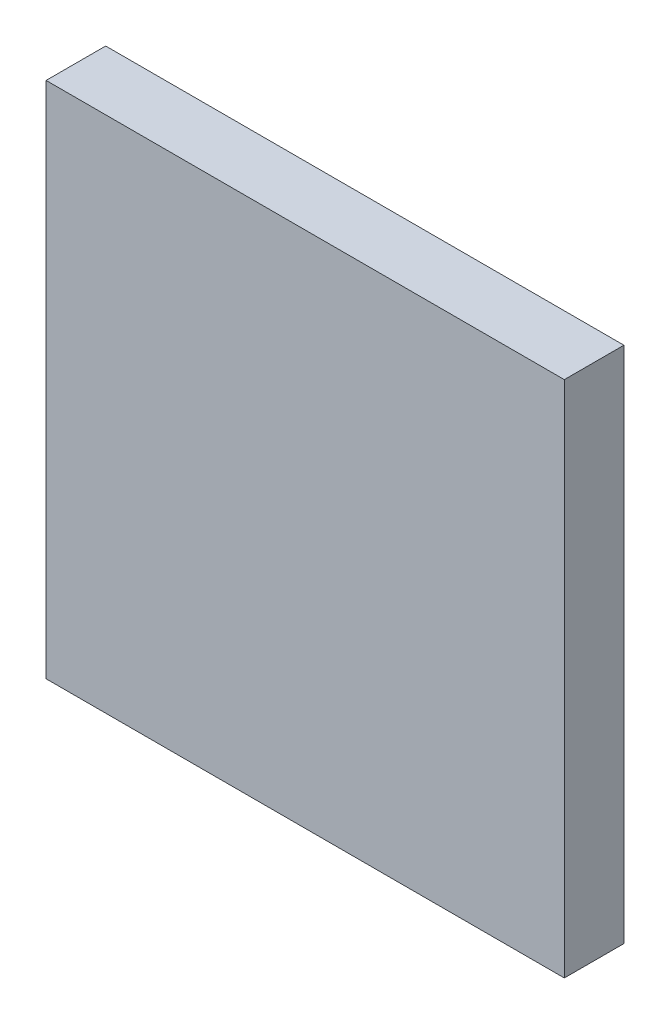
ISO-10303-21;
HEADER;
FILE_DESCRIPTION(('STEP AP214'),'2;1');
FILE_NAME('part.step','',(''),(''),'','','');
FILE_SCHEMA(('AUTOMOTIVE_DESIGN { 1 0 10303 214 1 1 1 1 }'));
ENDSEC;
DATA;
#1=APPLICATION_CONTEXT('core data for automotive mechanical design processes');
#2=APPLICATION_PROTOCOL_DEFINITION('international standard','automotive_design',2000,#1);
#3=PRODUCT_CONTEXT('',#1,'mechanical');
#4=PRODUCT('Part','Part','',(#3));
#5=PRODUCT_RELATED_PRODUCT_CATEGORY('part','',(#4));
#6=PRODUCT_DEFINITION_FORMATION('','',#4);
#7=PRODUCT_DEFINITION_CONTEXT('part definition',#1,'design');
#8=PRODUCT_DEFINITION('design','',#6,#7);
#9=PRODUCT_DEFINITION_SHAPE('','',#8);
#10=(LENGTH_UNIT() NAMED_UNIT(*) SI_UNIT(.MILLI.,.METRE.));
#11=(NAMED_UNIT(*) PLANE_ANGLE_UNIT() SI_UNIT($,.RADIAN.));
#12=(NAMED_UNIT(*) SI_UNIT($,.STERADIAN.) SOLID_ANGLE_UNIT());
#13=UNCERTAINTY_MEASURE_WITH_UNIT(LENGTH_MEASURE(1.E-05),#10,'distance_accuracy_value','');
#14=(GEOMETRIC_REPRESENTATION_CONTEXT(3) GLOBAL_UNCERTAINTY_ASSIGNED_CONTEXT((#13)) GLOBAL_UNIT_ASSIGNED_CONTEXT((#10,
#11,#12)) REPRESENTATION_CONTEXT('',''));
#15=CARTESIAN_POINT('',(0.,0.,0.));
#16=DIRECTION('',(0.,0.,1.));
#17=DIRECTION('',(1.,0.,0.));
#18=AXIS2_PLACEMENT_3D('',#15,#16,#17);
#19=CARTESIAN_POINT('',(0.,0.,-2.921));
#20=DIRECTION('',(-1.,0.,0.));
#21=DIRECTION('',(0.,0.,1.));
#22=AXIS2_PLACEMENT_3D('',#19,#20,#21);
#23=PLANE('',#22);
#24=DIRECTION('',(0.,-1.,0.));
#25=VECTOR('',#24,1.);
#26=CARTESIAN_POINT('',(0.,0.,0.));
#27=LINE('',#26,#25);
#28=CARTESIAN_POINT('',(0.,25.4,0.));
#29=VERTEX_POINT('',#28);
#30=CARTESIAN_POINT('',(0.,0.,0.));
#31=VERTEX_POINT('',#30);
#32=EDGE_CURVE('E100',#29,#31,#27,.T.);
#33=ORIENTED_EDGE('',*,*,#32,.F.);
#34=DIRECTION('',(0.,0.,1.));
#35=VECTOR('',#34,1.);
#36=CARTESIAN_POINT('',(0.,25.4,-2.921));
#37=LINE('',#36,#35);
#38=CARTESIAN_POINT('',(0.,25.4,-2.921));
#39=VERTEX_POINT('',#38);
#40=EDGE_CURVE('E11',#39,#29,#37,.T.);
#41=ORIENTED_EDGE('',*,*,#40,.F.);
#42=DIRECTION('',(0.,-1.,0.));
#43=VECTOR('',#42,1.);
#44=CARTESIAN_POINT('',(0.,0.,-2.921));
#45=LINE('',#44,#43);
#46=CARTESIAN_POINT('',(0.,0.,-2.921));
#47=VERTEX_POINT('',#46);
#48=EDGE_CURVE('E94',#39,#47,#45,.T.);
#49=ORIENTED_EDGE('',*,*,#48,.T.);
#50=DIRECTION('',(0.,0.,1.));
#51=VECTOR('',#50,1.);
#52=CARTESIAN_POINT('',(0.,0.,-2.921));
#53=LINE('',#52,#51);
#54=EDGE_CURVE('E39',#47,#31,#53,.T.);
#55=ORIENTED_EDGE('',*,*,#54,.T.);
#56=EDGE_LOOP('',(#33,#41,#49,#55));
#57=FACE_BOUND('',#56,.T.);
#58=ADVANCED_FACE('F36',(#57),#23,.T.);
#59=CARTESIAN_POINT('',(0.,25.4,-2.921));
#60=DIRECTION('',(0.,1.,0.));
#61=DIRECTION('',(0.,0.,1.));
#62=AXIS2_PLACEMENT_3D('',#59,#60,#61);
#63=PLANE('',#62);
#64=DIRECTION('',(-1.,0.,0.));
#65=VECTOR('',#64,1.);
#66=CARTESIAN_POINT('',(0.,25.4,0.));
#67=LINE('',#66,#65);
#68=CARTESIAN_POINT('',(25.4,25.4,0.));
#69=VERTEX_POINT('',#68);
#70=EDGE_CURVE('E96',#69,#29,#67,.T.);
#71=ORIENTED_EDGE('',*,*,#70,.F.);
#72=DIRECTION('',(0.,0.,1.));
#73=VECTOR('',#72,1.);
#74=CARTESIAN_POINT('',(25.4,25.4,-2.921));
#75=LINE('',#74,#73);
#76=CARTESIAN_POINT('',(25.4,25.4,-2.921));
#77=VERTEX_POINT('',#76);
#78=EDGE_CURVE('E45',#77,#69,#75,.T.);
#79=ORIENTED_EDGE('',*,*,#78,.F.);
#80=DIRECTION('',(-1.,0.,0.));
#81=VECTOR('',#80,1.);
#82=CARTESIAN_POINT('',(0.,25.4,-2.921));
#83=LINE('',#82,#81);
#84=EDGE_CURVE('E91',#77,#39,#83,.T.);
#85=ORIENTED_EDGE('',*,*,#84,.T.);
#86=ORIENTED_EDGE('',*,*,#40,.T.);
#87=EDGE_LOOP('',(#71,#79,#85,#86));
#88=FACE_BOUND('',#87,.T.);
#89=ADVANCED_FACE('F110',(#88),#63,.T.);
#90=CARTESIAN_POINT('',(25.4,0.,-2.921));
#91=DIRECTION('',(1.,0.,0.));
#92=DIRECTION('',(0.,0.,-1.));
#93=AXIS2_PLACEMENT_3D('',#90,#91,#92);
#94=PLANE('',#93);
#95=DIRECTION('',(0.,1.,0.));
#96=VECTOR('',#95,1.);
#97=CARTESIAN_POINT('',(25.4,0.,0.));
#98=LINE('',#97,#96);
#99=CARTESIAN_POINT('',(25.4,0.,0.));
#100=VERTEX_POINT('',#99);
#101=EDGE_CURVE('E86',#100,#69,#98,.T.);
#102=ORIENTED_EDGE('',*,*,#101,.F.);
#103=DIRECTION('',(0.,0.,1.));
#104=VECTOR('',#103,1.);
#105=CARTESIAN_POINT('',(25.4,0.,-2.921));
#106=LINE('',#105,#104);
#107=CARTESIAN_POINT('',(25.4,0.,-2.921));
#108=VERTEX_POINT('',#107);
#109=EDGE_CURVE('E81',#108,#100,#106,.T.);
#110=ORIENTED_EDGE('',*,*,#109,.F.);
#111=DIRECTION('',(0.,1.,0.));
#112=VECTOR('',#111,1.);
#113=CARTESIAN_POINT('',(25.4,0.,-2.921));
#114=LINE('',#113,#112);
#115=EDGE_CURVE('E84',#108,#77,#114,.T.);
#116=ORIENTED_EDGE('',*,*,#115,.T.);
#117=ORIENTED_EDGE('',*,*,#78,.T.);
#118=EDGE_LOOP('',(#102,#110,#116,#117));
#119=FACE_BOUND('',#118,.T.);
#120=ADVANCED_FACE('F83',(#119),#94,.T.);
#121=CARTESIAN_POINT('',(0.,0.,-2.921));
#122=DIRECTION('',(0.,-1.,0.));
#123=DIRECTION('',(0.,0.,-1.));
#124=AXIS2_PLACEMENT_3D('',#121,#122,#123);
#125=PLANE('',#124);
#126=DIRECTION('',(1.,0.,0.));
#127=VECTOR('',#126,1.);
#128=CARTESIAN_POINT('',(0.,0.,0.));
#129=LINE('',#128,#127);
#130=EDGE_CURVE('E103',#31,#100,#129,.T.);
#131=ORIENTED_EDGE('',*,*,#130,.F.);
#132=ORIENTED_EDGE('',*,*,#54,.F.);
#133=DIRECTION('',(1.,0.,0.));
#134=VECTOR('',#133,1.);
#135=CARTESIAN_POINT('',(0.,0.,-2.921));
#136=LINE('',#135,#134);
#137=EDGE_CURVE('E90',#47,#108,#136,.T.);
#138=ORIENTED_EDGE('',*,*,#137,.T.);
#139=ORIENTED_EDGE('',*,*,#109,.T.);
#140=EDGE_LOOP('',(#131,#132,#138,#139));
#141=FACE_BOUND('',#140,.T.);
#142=ADVANCED_FACE('F93',(#141),#125,.T.);
#143=CARTESIAN_POINT('',(0.,0.,-2.921));
#144=DIRECTION('',(0.,0.,-1.));
#145=DIRECTION('',(-1.,0.,0.));
#146=AXIS2_PLACEMENT_3D('',#143,#144,#145);
#147=PLANE('',#146);
#148=ORIENTED_EDGE('',*,*,#48,.F.);
#149=ORIENTED_EDGE('',*,*,#84,.F.);
#150=ORIENTED_EDGE('',*,*,#115,.F.);
#151=ORIENTED_EDGE('',*,*,#137,.F.);
#152=EDGE_LOOP('',(#148,#149,#150,#151));
#153=FACE_BOUND('',#152,.T.);
#154=ADVANCED_FACE('F89',(#153),#147,.T.);
#155=CARTESIAN_POINT('',(0.,0.,0.));
#156=DIRECTION('',(0.,0.,-1.));
#157=DIRECTION('',(-1.,0.,0.));
#158=AXIS2_PLACEMENT_3D('',#155,#156,#157);
#159=PLANE('',#158);
#160=ORIENTED_EDGE('',*,*,#32,.T.);
#161=ORIENTED_EDGE('',*,*,#130,.T.);
#162=ORIENTED_EDGE('',*,*,#101,.T.);
#163=ORIENTED_EDGE('',*,*,#70,.T.);
#164=EDGE_LOOP('',(#160,#161,#162,#163));
#165=FACE_BOUND('',#164,.T.);
#166=ADVANCED_FACE('F109',(#165),#159,.F.);
#167=CLOSED_SHELL('',(#58,#89,#120,#142,#154,#166));
#168=MANIFOLD_SOLID_BREP('B2',#167);
#169=ADVANCED_BREP_SHAPE_REPRESENTATION('',(#18,#168),#14);
#170=SHAPE_DEFINITION_REPRESENTATION(#9,#169);
ENDSEC;
END-ISO-10303-21;
